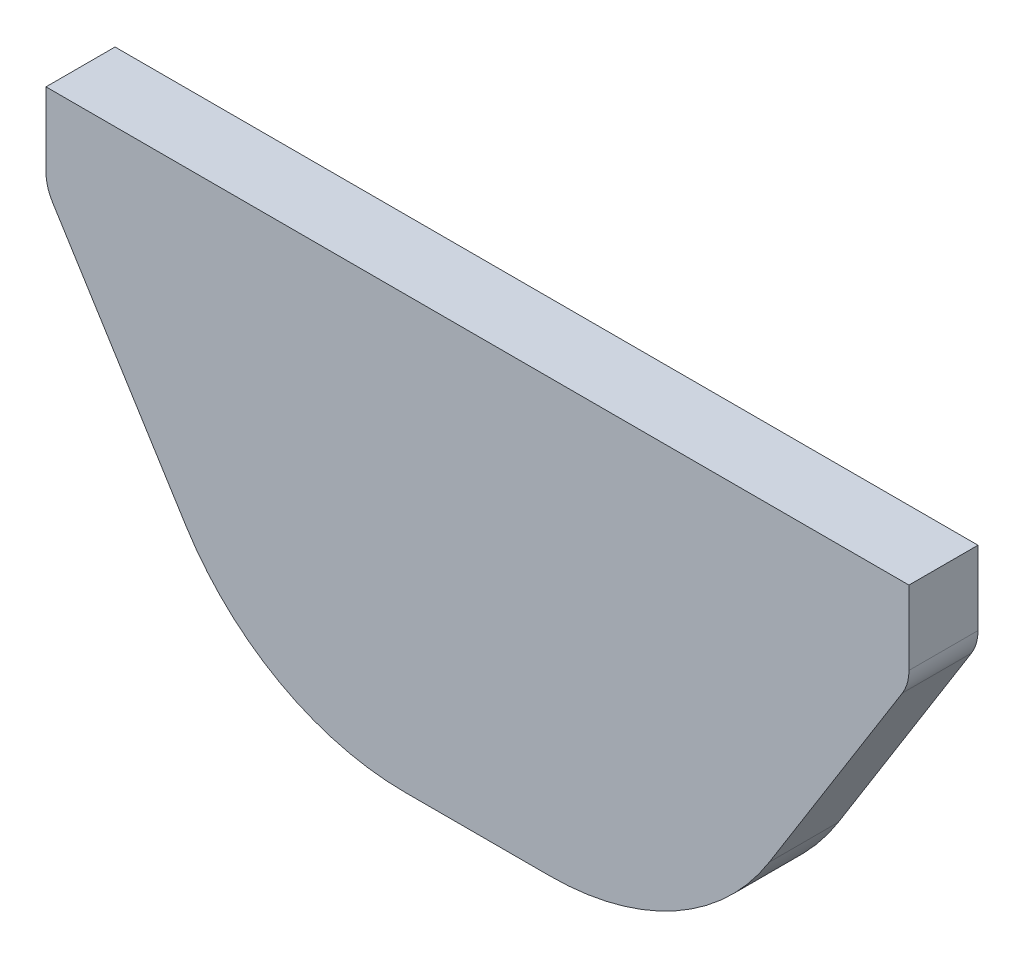
ISO-10303-21;
HEADER;
FILE_DESCRIPTION(('STEP AP214'),'2;1');
FILE_NAME('part.step','',(''),(''),'','','');
FILE_SCHEMA(('AUTOMOTIVE_DESIGN { 1 0 10303 214 1 1 1 1 }'));
ENDSEC;
DATA;
#1=APPLICATION_CONTEXT('core data for automotive mechanical design processes');
#2=APPLICATION_PROTOCOL_DEFINITION('international standard','automotive_design',2000,#1);
#3=PRODUCT_CONTEXT('',#1,'mechanical');
#4=PRODUCT('Part','Part','',(#3));
#5=PRODUCT_RELATED_PRODUCT_CATEGORY('part','',(#4));
#6=PRODUCT_DEFINITION_FORMATION('','',#4);
#7=PRODUCT_DEFINITION_CONTEXT('part definition',#1,'design');
#8=PRODUCT_DEFINITION('design','',#6,#7);
#9=PRODUCT_DEFINITION_SHAPE('','',#8);
#10=(LENGTH_UNIT() NAMED_UNIT(*) SI_UNIT(.MILLI.,.METRE.));
#11=(NAMED_UNIT(*) PLANE_ANGLE_UNIT() SI_UNIT($,.RADIAN.));
#12=(NAMED_UNIT(*) SI_UNIT($,.STERADIAN.) SOLID_ANGLE_UNIT());
#13=UNCERTAINTY_MEASURE_WITH_UNIT(LENGTH_MEASURE(1.E-05),#10,'distance_accuracy_value','');
#14=(GEOMETRIC_REPRESENTATION_CONTEXT(3) GLOBAL_UNCERTAINTY_ASSIGNED_CONTEXT((#13)) GLOBAL_UNIT_ASSIGNED_CONTEXT((#10,
#11,#12)) REPRESENTATION_CONTEXT('',''));
#15=CARTESIAN_POINT('',(0.,0.,0.));
#16=DIRECTION('',(0.,0.,1.));
#17=DIRECTION('',(1.,0.,0.));
#18=AXIS2_PLACEMENT_3D('',#15,#16,#17);
#19=CARTESIAN_POINT('',(-50.,40.,8.));
#20=DIRECTION('',(1.,0.,0.));
#21=DIRECTION('',(0.,0.,-1.));
#22=AXIS2_PLACEMENT_3D('',#19,#20,#21);
#23=PLANE('',#22);
#24=DIRECTION('',(0.,-1.,0.));
#25=VECTOR('',#24,1.);
#26=CARTESIAN_POINT('',(-50.,40.,0.));
#27=LINE('',#26,#25);
#28=CARTESIAN_POINT('',(-50.,50.,0.));
#29=VERTEX_POINT('',#28);
#30=CARTESIAN_POINT('',(-50.,41.4339811320566,0.));
#31=VERTEX_POINT('',#30);
#32=EDGE_CURVE('E137',#29,#31,#27,.T.);
#33=ORIENTED_EDGE('',*,*,#32,.T.);
#34=DIRECTION('',(0.,0.,-1.));
#35=VECTOR('',#34,1.);
#36=CARTESIAN_POINT('',(-50.,41.4339811320566,8.));
#37=LINE('',#36,#35);
#38=CARTESIAN_POINT('',(-50.,41.4339811320566,8.));
#39=VERTEX_POINT('',#38);
#40=EDGE_CURVE('E177',#31,#39,#37,.F.);
#41=ORIENTED_EDGE('',*,*,#40,.T.);
#42=DIRECTION('',(0.,-1.,0.));
#43=VECTOR('',#42,1.);
#44=CARTESIAN_POINT('',(-50.,40.,8.));
#45=LINE('',#44,#43);
#46=CARTESIAN_POINT('',(-50.,50.,8.));
#47=VERTEX_POINT('',#46);
#48=EDGE_CURVE('E149',#47,#39,#45,.T.);
#49=ORIENTED_EDGE('',*,*,#48,.F.);
#50=DIRECTION('',(0.,0.,-1.));
#51=VECTOR('',#50,1.);
#52=CARTESIAN_POINT('',(-50.,50.,8.));
#53=LINE('',#52,#51);
#54=EDGE_CURVE('E128',#47,#29,#53,.T.);
#55=ORIENTED_EDGE('',*,*,#54,.T.);
#56=EDGE_LOOP('',(#33,#41,#49,#55));
#57=FACE_BOUND('',#56,.T.);
#58=ADVANCED_FACE('F34',(#57),#23,.F.);
#59=CARTESIAN_POINT('',(-25.,0.,8.));
#60=DIRECTION('',(0.847998304005088,0.52999894000318,0.));
#61=DIRECTION('',(-0.52999894000318,0.847998304005088,0.));
#62=AXIS2_PLACEMENT_3D('',#59,#60,#61);
#63=PLANE('',#62);
#64=DIRECTION('',(0.52999894000318,-0.847998304005088,0.));
#65=VECTOR('',#64,1.);
#66=CARTESIAN_POINT('',(-25.,0.,8.));
#67=LINE('',#66,#65);
#68=CARTESIAN_POINT('',(-49.2399915200254,38.7839864320407,8.));
#69=VERTEX_POINT('',#68);
#70=CARTESIAN_POINT('',(-33.8125198749404,14.1000317999046,8.));
#71=VERTEX_POINT('',#70);
#72=EDGE_CURVE('E190',#69,#71,#67,.T.);
#73=ORIENTED_EDGE('',*,*,#72,.F.);
#74=DIRECTION('',(0.,0.,-1.));
#75=VECTOR('',#74,1.);
#76=CARTESIAN_POINT('',(-49.2399915200254,38.7839864320407,8.));
#77=LINE('',#76,#75);
#78=CARTESIAN_POINT('',(-49.2399915200254,38.7839864320407,0.));
#79=VERTEX_POINT('',#78);
#80=EDGE_CURVE('E170',#69,#79,#77,.T.);
#81=ORIENTED_EDGE('',*,*,#80,.T.);
#82=DIRECTION('',(0.52999894000318,-0.847998304005088,0.));
#83=VECTOR('',#82,1.);
#84=CARTESIAN_POINT('',(-25.,0.,0.));
#85=LINE('',#84,#83);
#86=CARTESIAN_POINT('',(-33.8125198749404,14.1000317999046,0.));
#87=VERTEX_POINT('',#86);
#88=EDGE_CURVE('E140',#79,#87,#85,.T.);
#89=ORIENTED_EDGE('',*,*,#88,.T.);
#90=DIRECTION('',(0.,0.,-1.));
#91=VECTOR('',#90,1.);
#92=CARTESIAN_POINT('',(-33.8125198749404,14.1000317999046,8.));
#93=LINE('',#92,#91);
#94=EDGE_CURVE('E160',#87,#71,#93,.F.);
#95=ORIENTED_EDGE('',*,*,#94,.T.);
#96=EDGE_LOOP('',(#73,#81,#89,#95));
#97=FACE_BOUND('',#96,.T.);
#98=ADVANCED_FACE('F206',(#97),#63,.F.);
#99=CARTESIAN_POINT('',(-25.,0.,8.));
#100=DIRECTION('',(0.,1.,0.));
#101=DIRECTION('',(0.,0.,1.));
#102=AXIS2_PLACEMENT_3D('',#99,#100,#101);
#103=PLANE('',#102);
#104=DIRECTION('',(1.,0.,0.));
#105=VECTOR('',#104,1.);
#106=CARTESIAN_POINT('',(-25.,0.,8.));
#107=LINE('',#106,#105);
#108=CARTESIAN_POINT('',(-8.37257075478774,0.,8.));
#109=VERTEX_POINT('',#108);
#110=CARTESIAN_POINT('',(8.37257075478774,0.,8.));
#111=VERTEX_POINT('',#110);
#112=EDGE_CURVE('E192',#109,#111,#107,.T.);
#113=ORIENTED_EDGE('',*,*,#112,.F.);
#114=DIRECTION('',(0.,0.,-1.));
#115=VECTOR('',#114,1.);
#116=CARTESIAN_POINT('',(-8.37257075478774,0.,8.));
#117=LINE('',#116,#115);
#118=CARTESIAN_POINT('',(-8.37257075478774,0.,0.));
#119=VERTEX_POINT('',#118);
#120=EDGE_CURVE('E152',#109,#119,#117,.T.);
#121=ORIENTED_EDGE('',*,*,#120,.T.);
#122=DIRECTION('',(1.,0.,0.));
#123=VECTOR('',#122,1.);
#124=CARTESIAN_POINT('',(-25.,0.,0.));
#125=LINE('',#124,#123);
#126=CARTESIAN_POINT('',(8.37257075478774,0.,0.));
#127=VERTEX_POINT('',#126);
#128=EDGE_CURVE('E142',#119,#127,#125,.T.);
#129=ORIENTED_EDGE('',*,*,#128,.T.);
#130=DIRECTION('',(0.,0.,-1.));
#131=VECTOR('',#130,1.);
#132=CARTESIAN_POINT('',(8.37257075478774,0.,8.));
#133=LINE('',#132,#131);
#134=EDGE_CURVE('E127',#127,#111,#133,.F.);
#135=ORIENTED_EDGE('',*,*,#134,.T.);
#136=EDGE_LOOP('',(#113,#121,#129,#135));
#137=FACE_BOUND('',#136,.T.);
#138=ADVANCED_FACE('F211',(#137),#103,.F.);
#139=CARTESIAN_POINT('',(25.,0.,8.));
#140=DIRECTION('',(-0.847998304005088,0.52999894000318,0.));
#141=DIRECTION('',(-0.52999894000318,-0.847998304005088,0.));
#142=AXIS2_PLACEMENT_3D('',#139,#140,#141);
#143=PLANE('',#142);
#144=DIRECTION('',(0.52999894000318,0.847998304005088,0.));
#145=VECTOR('',#144,1.);
#146=CARTESIAN_POINT('',(25.,0.,0.));
#147=LINE('',#146,#145);
#148=CARTESIAN_POINT('',(33.8125198749404,14.1000317999046,0.));
#149=VERTEX_POINT('',#148);
#150=CARTESIAN_POINT('',(49.2399915200254,38.7839864320407,0.));
#151=VERTEX_POINT('',#150);
#152=EDGE_CURVE('E145',#149,#151,#147,.T.);
#153=ORIENTED_EDGE('',*,*,#152,.T.);
#154=DIRECTION('',(0.,0.,-1.));
#155=VECTOR('',#154,1.);
#156=CARTESIAN_POINT('',(49.2399915200254,38.7839864320407,8.));
#157=LINE('',#156,#155);
#158=CARTESIAN_POINT('',(49.2399915200254,38.7839864320407,8.));
#159=VERTEX_POINT('',#158);
#160=EDGE_CURVE('E11',#151,#159,#157,.F.);
#161=ORIENTED_EDGE('',*,*,#160,.T.);
#162=DIRECTION('',(0.52999894000318,0.847998304005088,0.));
#163=VECTOR('',#162,1.);
#164=CARTESIAN_POINT('',(25.,0.,8.));
#165=LINE('',#164,#163);
#166=CARTESIAN_POINT('',(33.8125198749404,14.1000317999046,8.));
#167=VERTEX_POINT('',#166);
#168=EDGE_CURVE('E118',#167,#159,#165,.T.);
#169=ORIENTED_EDGE('',*,*,#168,.F.);
#170=DIRECTION('',(0.,0.,-1.));
#171=VECTOR('',#170,1.);
#172=CARTESIAN_POINT('',(33.8125198749404,14.1000317999046,8.));
#173=LINE('',#172,#171);
#174=EDGE_CURVE('E167',#167,#149,#173,.T.);
#175=ORIENTED_EDGE('',*,*,#174,.T.);
#176=EDGE_LOOP('',(#153,#161,#169,#175));
#177=FACE_BOUND('',#176,.T.);
#178=ADVANCED_FACE('F225',(#177),#143,.F.);
#179=CARTESIAN_POINT('',(50.,40.,8.));
#180=DIRECTION('',(-1.,0.,0.));
#181=DIRECTION('',(0.,0.,1.));
#182=AXIS2_PLACEMENT_3D('',#179,#180,#181);
#183=PLANE('',#182);
#184=DIRECTION('',(0.,1.,0.));
#185=VECTOR('',#184,1.);
#186=CARTESIAN_POINT('',(50.,40.,8.));
#187=LINE('',#186,#185);
#188=CARTESIAN_POINT('',(50.,41.4339811320566,8.));
#189=VERTEX_POINT('',#188);
#190=CARTESIAN_POINT('',(50.,50.,8.));
#191=VERTEX_POINT('',#190);
#192=EDGE_CURVE('E108',#189,#191,#187,.T.);
#193=ORIENTED_EDGE('',*,*,#192,.F.);
#194=DIRECTION('',(0.,0.,-1.));
#195=VECTOR('',#194,1.);
#196=CARTESIAN_POINT('',(50.,41.4339811320566,8.));
#197=LINE('',#196,#195);
#198=CARTESIAN_POINT('',(50.,41.4339811320566,0.));
#199=VERTEX_POINT('',#198);
#200=EDGE_CURVE('E42',#189,#199,#197,.T.);
#201=ORIENTED_EDGE('',*,*,#200,.T.);
#202=DIRECTION('',(0.,1.,0.));
#203=VECTOR('',#202,1.);
#204=CARTESIAN_POINT('',(50.,40.,0.));
#205=LINE('',#204,#203);
#206=CARTESIAN_POINT('',(50.,50.,0.));
#207=VERTEX_POINT('',#206);
#208=EDGE_CURVE('E124',#199,#207,#205,.T.);
#209=ORIENTED_EDGE('',*,*,#208,.T.);
#210=DIRECTION('',(0.,0.,-1.));
#211=VECTOR('',#210,1.);
#212=CARTESIAN_POINT('',(50.,50.,8.));
#213=LINE('',#212,#211);
#214=EDGE_CURVE('E121',#191,#207,#213,.T.);
#215=ORIENTED_EDGE('',*,*,#214,.F.);
#216=EDGE_LOOP('',(#193,#201,#209,#215));
#217=FACE_BOUND('',#216,.T.);
#218=ADVANCED_FACE('F122',(#217),#183,.F.);
#219=CARTESIAN_POINT('',(50.,50.,8.));
#220=DIRECTION('',(0.,-1.,0.));
#221=DIRECTION('',(0.,0.,-1.));
#222=AXIS2_PLACEMENT_3D('',#219,#220,#221);
#223=PLANE('',#222);
#224=DIRECTION('',(-1.,0.,0.));
#225=VECTOR('',#224,1.);
#226=CARTESIAN_POINT('',(50.,50.,0.));
#227=LINE('',#226,#225);
#228=EDGE_CURVE('E148',#207,#29,#227,.T.);
#229=ORIENTED_EDGE('',*,*,#228,.T.);
#230=ORIENTED_EDGE('',*,*,#54,.F.);
#231=DIRECTION('',(-1.,0.,0.));
#232=VECTOR('',#231,1.);
#233=CARTESIAN_POINT('',(50.,50.,8.));
#234=LINE('',#233,#232);
#235=EDGE_CURVE('E113',#191,#47,#234,.T.);
#236=ORIENTED_EDGE('',*,*,#235,.F.);
#237=ORIENTED_EDGE('',*,*,#214,.T.);
#238=EDGE_LOOP('',(#229,#230,#236,#237));
#239=FACE_BOUND('',#238,.T.);
#240=ADVANCED_FACE('F130',(#239),#223,.F.);
#241=CARTESIAN_POINT('',(0.,0.,8.));
#242=DIRECTION('',(0.,0.,1.));
#243=DIRECTION('',(1.,0.,0.));
#244=AXIS2_PLACEMENT_3D('',#241,#242,#243);
#245=PLANE('',#244);
#246=ORIENTED_EDGE('',*,*,#48,.T.);
#247=CARTESIAN_POINT('',(-45.,41.4339811320566,8.));
#248=DIRECTION('',(0.,0.,1.));
#249=DIRECTION('',(1.,0.,0.));
#250=AXIS2_PLACEMENT_3D('',#247,#248,#249);
#251=CIRCLE('',#250,5.);
#252=EDGE_CURVE('E180',#39,#69,#251,.T.);
#253=ORIENTED_EDGE('',*,*,#252,.T.);
#254=ORIENTED_EDGE('',*,*,#72,.T.);
#255=CARTESIAN_POINT('',(-8.37257075478774,30.,8.));
#256=DIRECTION('',(0.,0.,1.));
#257=DIRECTION('',(1.,0.,0.));
#258=AXIS2_PLACEMENT_3D('',#255,#256,#257);
#259=CIRCLE('',#258,30.);
#260=EDGE_CURVE('E165',#71,#109,#259,.T.);
#261=ORIENTED_EDGE('',*,*,#260,.T.);
#262=ORIENTED_EDGE('',*,*,#112,.T.);
#263=CARTESIAN_POINT('',(8.37257075478774,30.,8.));
#264=DIRECTION('',(0.,0.,1.));
#265=DIRECTION('',(1.,0.,0.));
#266=AXIS2_PLACEMENT_3D('',#263,#264,#265);
#267=CIRCLE('',#266,30.);
#268=EDGE_CURVE('E163',#111,#167,#267,.T.);
#269=ORIENTED_EDGE('',*,*,#268,.T.);
#270=ORIENTED_EDGE('',*,*,#168,.T.);
#271=CARTESIAN_POINT('',(45.,41.4339811320566,8.));
#272=DIRECTION('',(0.,0.,1.));
#273=DIRECTION('',(1.,0.,0.));
#274=AXIS2_PLACEMENT_3D('',#271,#272,#273);
#275=CIRCLE('',#274,5.);
#276=EDGE_CURVE('E49',#159,#189,#275,.T.);
#277=ORIENTED_EDGE('',*,*,#276,.T.);
#278=ORIENTED_EDGE('',*,*,#192,.T.);
#279=ORIENTED_EDGE('',*,*,#235,.T.);
#280=EDGE_LOOP('',(#246,#253,#254,#261,#262,#269,#270,#277,#278,#279));
#281=FACE_BOUND('',#280,.T.);
#282=ADVANCED_FACE('F111',(#281),#245,.T.);
#283=CARTESIAN_POINT('',(0.,0.,0.));
#284=DIRECTION('',(0.,0.,1.));
#285=DIRECTION('',(1.,0.,0.));
#286=AXIS2_PLACEMENT_3D('',#283,#284,#285);
#287=PLANE('',#286);
#288=ORIENTED_EDGE('',*,*,#88,.F.);
#289=CARTESIAN_POINT('',(-45.,41.4339811320566,0.));
#290=DIRECTION('',(0.,0.,1.));
#291=DIRECTION('',(1.,0.,0.));
#292=AXIS2_PLACEMENT_3D('',#289,#290,#291);
#293=CIRCLE('',#292,5.);
#294=EDGE_CURVE('E175',#79,#31,#293,.F.);
#295=ORIENTED_EDGE('',*,*,#294,.T.);
#296=ORIENTED_EDGE('',*,*,#32,.F.);
#297=ORIENTED_EDGE('',*,*,#228,.F.);
#298=ORIENTED_EDGE('',*,*,#208,.F.);
#299=CARTESIAN_POINT('',(45.,41.4339811320566,0.));
#300=DIRECTION('',(0.,0.,1.));
#301=DIRECTION('',(1.,0.,0.));
#302=AXIS2_PLACEMENT_3D('',#299,#300,#301);
#303=CIRCLE('',#302,5.);
#304=EDGE_CURVE('E173',#199,#151,#303,.F.);
#305=ORIENTED_EDGE('',*,*,#304,.T.);
#306=ORIENTED_EDGE('',*,*,#152,.F.);
#307=CARTESIAN_POINT('',(8.37257075478774,30.,0.));
#308=DIRECTION('',(0.,0.,1.));
#309=DIRECTION('',(1.,0.,0.));
#310=AXIS2_PLACEMENT_3D('',#307,#308,#309);
#311=CIRCLE('',#310,30.);
#312=EDGE_CURVE('E155',#149,#127,#311,.F.);
#313=ORIENTED_EDGE('',*,*,#312,.T.);
#314=ORIENTED_EDGE('',*,*,#128,.F.);
#315=CARTESIAN_POINT('',(-8.37257075478774,30.,0.));
#316=DIRECTION('',(0.,0.,1.));
#317=DIRECTION('',(1.,0.,0.));
#318=AXIS2_PLACEMENT_3D('',#315,#316,#317);
#319=CIRCLE('',#318,30.);
#320=EDGE_CURVE('E157',#119,#87,#319,.F.);
#321=ORIENTED_EDGE('',*,*,#320,.T.);
#322=EDGE_LOOP('',(#288,#295,#296,#297,#298,#305,#306,#313,#314,#321));
#323=FACE_BOUND('',#322,.T.);
#324=ADVANCED_FACE('F184',(#323),#287,.F.);
#325=CARTESIAN_POINT('',(-8.37257075478774,30.,8.));
#326=DIRECTION('',(0.,0.,-1.));
#327=DIRECTION('',(-1.,0.,0.));
#328=AXIS2_PLACEMENT_3D('',#325,#326,#327);
#329=CYLINDRICAL_SURFACE('',#328,30.);
#330=ORIENTED_EDGE('',*,*,#260,.F.);
#331=ORIENTED_EDGE('',*,*,#94,.F.);
#332=ORIENTED_EDGE('',*,*,#320,.F.);
#333=ORIENTED_EDGE('',*,*,#120,.F.);
#334=EDGE_LOOP('',(#330,#331,#332,#333));
#335=FACE_BOUND('',#334,.T.);
#336=ADVANCED_FACE('F216',(#335),#329,.T.);
#337=CARTESIAN_POINT('',(8.37257075478774,30.,8.));
#338=DIRECTION('',(0.,0.,-1.));
#339=DIRECTION('',(-1.,0.,0.));
#340=AXIS2_PLACEMENT_3D('',#337,#338,#339);
#341=CYLINDRICAL_SURFACE('',#340,30.);
#342=ORIENTED_EDGE('',*,*,#268,.F.);
#343=ORIENTED_EDGE('',*,*,#134,.F.);
#344=ORIENTED_EDGE('',*,*,#312,.F.);
#345=ORIENTED_EDGE('',*,*,#174,.F.);
#346=EDGE_LOOP('',(#342,#343,#344,#345));
#347=FACE_BOUND('',#346,.T.);
#348=ADVANCED_FACE('F203',(#347),#341,.T.);
#349=CARTESIAN_POINT('',(-45.,41.4339811320566,8.));
#350=DIRECTION('',(0.,0.,-1.));
#351=DIRECTION('',(-1.,0.,0.));
#352=AXIS2_PLACEMENT_3D('',#349,#350,#351);
#353=CYLINDRICAL_SURFACE('',#352,5.);
#354=ORIENTED_EDGE('',*,*,#252,.F.);
#355=ORIENTED_EDGE('',*,*,#40,.F.);
#356=ORIENTED_EDGE('',*,*,#294,.F.);
#357=ORIENTED_EDGE('',*,*,#80,.F.);
#358=EDGE_LOOP('',(#354,#355,#356,#357));
#359=FACE_BOUND('',#358,.T.);
#360=ADVANCED_FACE('F199',(#359),#353,.T.);
#361=CARTESIAN_POINT('',(45.,41.4339811320566,8.));
#362=DIRECTION('',(0.,0.,-1.));
#363=DIRECTION('',(-1.,0.,0.));
#364=AXIS2_PLACEMENT_3D('',#361,#362,#363);
#365=CYLINDRICAL_SURFACE('',#364,5.);
#366=ORIENTED_EDGE('',*,*,#276,.F.);
#367=ORIENTED_EDGE('',*,*,#160,.F.);
#368=ORIENTED_EDGE('',*,*,#304,.F.);
#369=ORIENTED_EDGE('',*,*,#200,.F.);
#370=EDGE_LOOP('',(#366,#367,#368,#369));
#371=FACE_BOUND('',#370,.T.);
#372=ADVANCED_FACE('F36',(#371),#365,.T.);
#373=CLOSED_SHELL('',(#58,#98,#138,#178,#218,#240,#282,#324,#336,#348,#360,#372));
#374=MANIFOLD_SOLID_BREP('B2',#373);
#375=ADVANCED_BREP_SHAPE_REPRESENTATION('',(#18,#374),#14);
#376=SHAPE_DEFINITION_REPRESENTATION(#9,#375);
ENDSEC;
END-ISO-10303-21;
